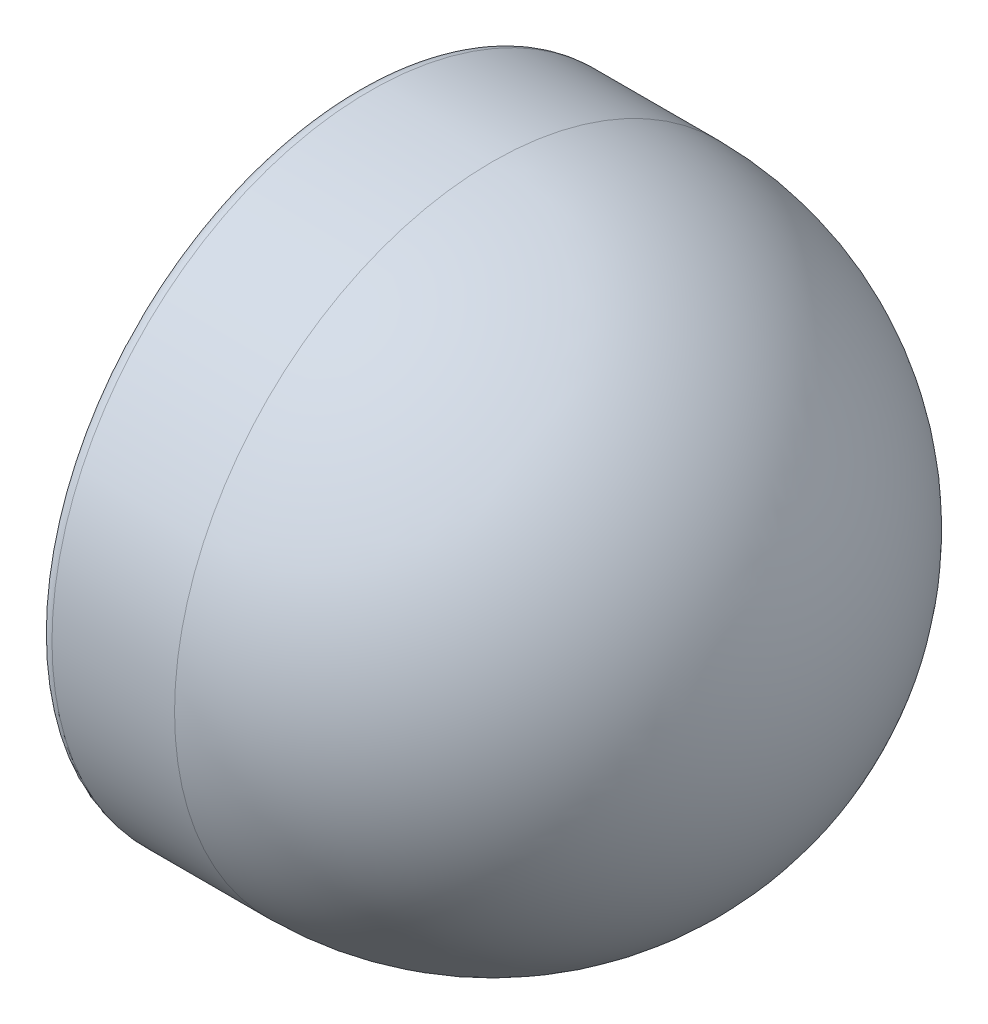
ISO-10303-21;
HEADER;
FILE_DESCRIPTION(('STEP AP214'),'2;1');
FILE_NAME('part.step','',(''),(''),'','','');
FILE_SCHEMA(('AUTOMOTIVE_DESIGN { 1 0 10303 214 1 1 1 1 }'));
ENDSEC;
DATA;
#1=APPLICATION_CONTEXT('core data for automotive mechanical design processes');
#2=APPLICATION_PROTOCOL_DEFINITION('international standard','automotive_design',2000,#1);
#3=PRODUCT_CONTEXT('',#1,'mechanical');
#4=PRODUCT('Part','Part','',(#3));
#5=PRODUCT_RELATED_PRODUCT_CATEGORY('part','',(#4));
#6=PRODUCT_DEFINITION_FORMATION('','',#4);
#7=PRODUCT_DEFINITION_CONTEXT('part definition',#1,'design');
#8=PRODUCT_DEFINITION('design','',#6,#7);
#9=PRODUCT_DEFINITION_SHAPE('','',#8);
#10=(LENGTH_UNIT() NAMED_UNIT(*) SI_UNIT(.MILLI.,.METRE.));
#11=(NAMED_UNIT(*) PLANE_ANGLE_UNIT() SI_UNIT($,.RADIAN.));
#12=(NAMED_UNIT(*) SI_UNIT($,.STERADIAN.) SOLID_ANGLE_UNIT());
#13=UNCERTAINTY_MEASURE_WITH_UNIT(LENGTH_MEASURE(1.E-05),#10,'distance_accuracy_value','');
#14=(GEOMETRIC_REPRESENTATION_CONTEXT(3) GLOBAL_UNCERTAINTY_ASSIGNED_CONTEXT((#13)) GLOBAL_UNIT_ASSIGNED_CONTEXT((#10,
#11,#12)) REPRESENTATION_CONTEXT('',''));
#15=CARTESIAN_POINT('',(0.,0.,0.));
#16=DIRECTION('',(0.,0.,1.));
#17=DIRECTION('',(1.,0.,0.));
#18=AXIS2_PLACEMENT_3D('',#15,#16,#17);
#19=CARTESIAN_POINT('',(-70.,0.,0.));
#20=DIRECTION('',(-1.,0.,0.));
#21=DIRECTION('',(0.,1.,0.));
#22=AXIS2_PLACEMENT_3D('',#19,#20,#21);
#23=SPHERICAL_SURFACE('',#22,70.);
#24=CARTESIAN_POINT('',(-70.,0.,0.));
#25=DIRECTION('',(-1.,0.,0.));
#26=DIRECTION('',(0.,0.,1.));
#27=AXIS2_PLACEMENT_3D('',#24,#25,#26);
#28=CIRCLE('',#27,70.);
#29=CARTESIAN_POINT('',(-70.,0.,70.));
#30=VERTEX_POINT('',#29);
#31=EDGE_CURVE('E10',#30,#30,#28,.T.);
#32=ORIENTED_EDGE('',*,*,#31,.F.);
#33=EDGE_LOOP('',(#32));
#34=FACE_BOUND('',#33,.T.);
#35=ADVANCED_FACE('F31',(#34),#23,.T.);
#36=CARTESIAN_POINT('',(-70.,0.,0.));
#37=DIRECTION('',(-1.,0.,0.));
#38=DIRECTION('',(0.,0.,1.));
#39=AXIS2_PLACEMENT_3D('',#36,#37,#38);
#40=CYLINDRICAL_SURFACE('',#39,70.);
#41=CARTESIAN_POINT('',(-97.,0.,0.));
#42=DIRECTION('',(-1.,0.,0.));
#43=DIRECTION('',(0.,0.,1.));
#44=AXIS2_PLACEMENT_3D('',#41,#42,#43);
#45=CIRCLE('',#44,70.);
#46=CARTESIAN_POINT('',(-97.,0.,70.));
#47=VERTEX_POINT('',#46);
#48=EDGE_CURVE('E37',#47,#47,#45,.T.);
#49=ORIENTED_EDGE('',*,*,#48,.F.);
#50=EDGE_LOOP('',(#49));
#51=FACE_BOUND('',#50,.T.);
#52=ORIENTED_EDGE('',*,*,#31,.T.);
#53=EDGE_LOOP('',(#52));
#54=FACE_BOUND('',#53,.T.);
#55=ADVANCED_FACE('F178',(#51,#54),#40,.T.);
#56=CARTESIAN_POINT('',(-97.,0.,0.));
#57=DIRECTION('',(-1.,0.,0.));
#58=DIRECTION('',(0.,0.,1.));
#59=AXIS2_PLACEMENT_3D('',#56,#57,#58);
#60=TOROIDAL_SURFACE('',#59,67.,3.);
#61=CARTESIAN_POINT('',(-100.,0.,0.));
#62=DIRECTION('',(-1.,0.,0.));
#63=DIRECTION('',(0.,0.,1.));
#64=AXIS2_PLACEMENT_3D('',#61,#62,#63);
#65=CIRCLE('',#64,67.);
#66=CARTESIAN_POINT('',(-100.,0.,67.));
#67=VERTEX_POINT('',#66);
#68=EDGE_CURVE('E41',#67,#67,#65,.T.);
#69=ORIENTED_EDGE('',*,*,#68,.F.);
#70=EDGE_LOOP('',(#69));
#71=FACE_BOUND('',#70,.T.);
#72=ORIENTED_EDGE('',*,*,#48,.T.);
#73=EDGE_LOOP('',(#72));
#74=FACE_BOUND('',#73,.T.);
#75=ADVANCED_FACE('F173',(#71,#74),#60,.T.);
#76=CARTESIAN_POINT('',(-100.,67.,0.));
#77=DIRECTION('',(1.,0.,0.));
#78=DIRECTION('',(0.,0.,-1.));
#79=AXIS2_PLACEMENT_3D('',#76,#77,#78);
#80=PLANE('',#79);
#81=CARTESIAN_POINT('',(-100.,0.,0.));
#82=DIRECTION('',(-1.,0.,0.));
#83=DIRECTION('',(0.,0.,1.));
#84=AXIS2_PLACEMENT_3D('',#81,#82,#83);
#85=CIRCLE('',#84,61.5);
#86=CARTESIAN_POINT('',(-100.,0.,61.5));
#87=VERTEX_POINT('',#86);
#88=EDGE_CURVE('E45',#87,#87,#85,.T.);
#89=ORIENTED_EDGE('',*,*,#88,.F.);
#90=EDGE_LOOP('',(#89));
#91=FACE_BOUND('',#90,.T.);
#92=ORIENTED_EDGE('',*,*,#68,.T.);
#93=EDGE_LOOP('',(#92));
#94=FACE_BOUND('',#93,.T.);
#95=ADVANCED_FACE('F167',(#91,#94),#80,.F.);
#96=CARTESIAN_POINT('',(-98.5,0.,0.));
#97=DIRECTION('',(-1.,0.,0.));
#98=DIRECTION('',(0.,0.,1.));
#99=AXIS2_PLACEMENT_3D('',#96,#97,#98);
#100=TOROIDAL_SURFACE('',#99,61.5,1.5);
#101=CARTESIAN_POINT('',(-98.5,0.,0.));
#102=DIRECTION('',(-1.,0.,0.));
#103=DIRECTION('',(0.,0.,1.));
#104=AXIS2_PLACEMENT_3D('',#101,#102,#103);
#105=CIRCLE('',#104,60.);
#106=CARTESIAN_POINT('',(-98.5,0.,60.));
#107=VERTEX_POINT('',#106);
#108=EDGE_CURVE('E50',#107,#107,#105,.T.);
#109=ORIENTED_EDGE('',*,*,#108,.F.);
#110=EDGE_LOOP('',(#109));
#111=FACE_BOUND('',#110,.T.);
#112=ORIENTED_EDGE('',*,*,#88,.T.);
#113=EDGE_LOOP('',(#112));
#114=FACE_BOUND('',#113,.T.);
#115=ADVANCED_FACE('F161',(#111,#114),#100,.T.);
#116=CARTESIAN_POINT('',(-70.,0.,0.));
#117=DIRECTION('',(-1.,0.,0.));
#118=DIRECTION('',(0.,0.,1.));
#119=AXIS2_PLACEMENT_3D('',#116,#117,#118);
#120=CYLINDRICAL_SURFACE('',#119,60.);
#121=CARTESIAN_POINT('',(-96.6213203435597,0.,0.));
#122=DIRECTION('',(-1.,0.,0.));
#123=DIRECTION('',(0.,0.,1.));
#124=AXIS2_PLACEMENT_3D('',#121,#122,#123);
#125=CIRCLE('',#124,60.);
#126=CARTESIAN_POINT('',(-96.6213203435597,0.,60.));
#127=VERTEX_POINT('',#126);
#128=EDGE_CURVE('E53',#127,#127,#125,.T.);
#129=ORIENTED_EDGE('',*,*,#128,.F.);
#130=EDGE_LOOP('',(#129));
#131=FACE_BOUND('',#130,.T.);
#132=ORIENTED_EDGE('',*,*,#108,.T.);
#133=EDGE_LOOP('',(#132));
#134=FACE_BOUND('',#133,.T.);
#135=ADVANCED_FACE('F155',(#131,#134),#120,.F.);
#136=CARTESIAN_POINT('',(-96.6213203435597,0.,0.));
#137=DIRECTION('',(-1.,0.,0.));
#138=DIRECTION('',(0.,0.,1.));
#139=AXIS2_PLACEMENT_3D('',#136,#137,#138);
#140=TOROIDAL_SURFACE('',#139,61.5,1.5);
#141=CARTESIAN_POINT('',(-95.5606601717798,0.,0.));
#142=DIRECTION('',(-1.,0.,0.));
#143=DIRECTION('',(0.,0.,1.));
#144=AXIS2_PLACEMENT_3D('',#141,#142,#143);
#145=CIRCLE('',#144,60.4393398282202);
#146=CARTESIAN_POINT('',(-95.5606601717798,0.,60.4393398282202));
#147=VERTEX_POINT('',#146);
#148=EDGE_CURVE('E56',#147,#147,#145,.T.);
#149=ORIENTED_EDGE('',*,*,#148,.F.);
#150=EDGE_LOOP('',(#149));
#151=FACE_BOUND('',#150,.T.);
#152=ORIENTED_EDGE('',*,*,#128,.T.);
#153=EDGE_LOOP('',(#152));
#154=FACE_BOUND('',#153,.T.);
#155=ADVANCED_FACE('F149',(#151,#154),#140,.T.);
#156=CARTESIAN_POINT('',(-95.5606601717798,0.,0.));
#157=DIRECTION('',(1.,0.,0.));
#158=DIRECTION('',(0.,0.,-1.));
#159=AXIS2_PLACEMENT_3D('',#156,#157,#158);
#160=CONICAL_SURFACE('',#159,60.4393398282202,0.785398163397451);
#161=CARTESIAN_POINT('',(-92.,0.,0.));
#162=DIRECTION('',(-1.,0.,0.));
#163=DIRECTION('',(0.,0.,1.));
#164=AXIS2_PLACEMENT_3D('',#161,#162,#163);
#165=CIRCLE('',#164,64.);
#166=CARTESIAN_POINT('',(-92.,0.,64.));
#167=VERTEX_POINT('',#166);
#168=EDGE_CURVE('E59',#167,#167,#165,.T.);
#169=ORIENTED_EDGE('',*,*,#168,.F.);
#170=EDGE_LOOP('',(#169));
#171=FACE_BOUND('',#170,.T.);
#172=ORIENTED_EDGE('',*,*,#148,.T.);
#173=EDGE_LOOP('',(#172));
#174=FACE_BOUND('',#173,.T.);
#175=ADVANCED_FACE('F143',(#171,#174),#160,.F.);
#176=CARTESIAN_POINT('',(-92.,64.,0.));
#177=DIRECTION('',(-1.,0.,0.));
#178=DIRECTION('',(0.,0.,1.));
#179=AXIS2_PLACEMENT_3D('',#176,#177,#178);
#180=PLANE('',#179);
#181=CARTESIAN_POINT('',(-92.,0.,0.));
#182=DIRECTION('',(-1.,0.,0.));
#183=DIRECTION('',(0.,0.,1.));
#184=AXIS2_PLACEMENT_3D('',#181,#182,#183);
#185=CIRCLE('',#184,64.7071067811866);
#186=CARTESIAN_POINT('',(-92.,0.,64.7071067811866));
#187=VERTEX_POINT('',#186);
#188=EDGE_CURVE('E62',#187,#187,#185,.T.);
#189=ORIENTED_EDGE('',*,*,#188,.F.);
#190=EDGE_LOOP('',(#189));
#191=FACE_BOUND('',#190,.T.);
#192=ORIENTED_EDGE('',*,*,#168,.T.);
#193=EDGE_LOOP('',(#192));
#194=FACE_BOUND('',#193,.T.);
#195=ADVANCED_FACE('F137',(#191,#194),#180,.F.);
#196=CARTESIAN_POINT('',(-70.,0.,0.));
#197=DIRECTION('',(-1.,0.,0.));
#198=DIRECTION('',(0.,0.,1.));
#199=AXIS2_PLACEMENT_3D('',#196,#197,#198);
#200=CYLINDRICAL_SURFACE('',#199,64.7071067811866);
#201=CARTESIAN_POINT('',(-92.7071067811866,0.,0.));
#202=DIRECTION('',(-1.,0.,0.));
#203=DIRECTION('',(0.,0.,1.));
#204=AXIS2_PLACEMENT_3D('',#201,#202,#203);
#205=CIRCLE('',#204,64.7071067811866);
#206=CARTESIAN_POINT('',(-92.7071067811866,0.,64.7071067811866));
#207=VERTEX_POINT('',#206);
#208=EDGE_CURVE('E65',#207,#207,#205,.T.);
#209=ORIENTED_EDGE('',*,*,#208,.F.);
#210=EDGE_LOOP('',(#209));
#211=FACE_BOUND('',#210,.T.);
#212=ORIENTED_EDGE('',*,*,#188,.T.);
#213=EDGE_LOOP('',(#212));
#214=FACE_BOUND('',#213,.T.);
#215=ADVANCED_FACE('F131',(#211,#214),#200,.T.);
#216=CARTESIAN_POINT('',(-92.7071067811866,0.,0.));
#217=DIRECTION('',(1.,0.,0.));
#218=DIRECTION('',(0.,0.,-1.));
#219=AXIS2_PLACEMENT_3D('',#216,#217,#218);
#220=CONICAL_SURFACE('',#219,64.7071067811866,0.785398163397449);
#221=CARTESIAN_POINT('',(-96.2677669529664,0.,0.));
#222=DIRECTION('',(-1.,0.,0.));
#223=DIRECTION('',(0.,0.,1.));
#224=AXIS2_PLACEMENT_3D('',#221,#222,#223);
#225=CIRCLE('',#224,61.1464466094067);
#226=CARTESIAN_POINT('',(-96.2677669529664,0.,61.1464466094067));
#227=VERTEX_POINT('',#226);
#228=EDGE_CURVE('E68',#227,#227,#225,.T.);
#229=ORIENTED_EDGE('',*,*,#228,.F.);
#230=EDGE_LOOP('',(#229));
#231=FACE_BOUND('',#230,.T.);
#232=ORIENTED_EDGE('',*,*,#208,.T.);
#233=EDGE_LOOP('',(#232));
#234=FACE_BOUND('',#233,.T.);
#235=ADVANCED_FACE('F125',(#231,#234),#220,.T.);
#236=CARTESIAN_POINT('',(-96.6213203435597,0.,0.));
#237=DIRECTION('',(-1.,0.,0.));
#238=DIRECTION('',(0.,0.,1.));
#239=AXIS2_PLACEMENT_3D('',#236,#237,#238);
#240=TOROIDAL_SURFACE('',#239,61.5,0.499999999999999);
#241=CARTESIAN_POINT('',(-96.6213203435597,0.,0.));
#242=DIRECTION('',(-1.,0.,0.));
#243=DIRECTION('',(0.,0.,1.));
#244=AXIS2_PLACEMENT_3D('',#241,#242,#243);
#245=CIRCLE('',#244,61.);
#246=CARTESIAN_POINT('',(-96.6213203435597,0.,61.));
#247=VERTEX_POINT('',#246);
#248=EDGE_CURVE('E71',#247,#247,#245,.T.);
#249=ORIENTED_EDGE('',*,*,#248,.F.);
#250=EDGE_LOOP('',(#249));
#251=FACE_BOUND('',#250,.T.);
#252=ORIENTED_EDGE('',*,*,#228,.T.);
#253=EDGE_LOOP('',(#252));
#254=FACE_BOUND('',#253,.T.);
#255=ADVANCED_FACE('F119',(#251,#254),#240,.F.);
#256=CARTESIAN_POINT('',(-70.,0.,0.));
#257=DIRECTION('',(-1.,0.,0.));
#258=DIRECTION('',(0.,0.,1.));
#259=AXIS2_PLACEMENT_3D('',#256,#257,#258);
#260=CYLINDRICAL_SURFACE('',#259,61.);
#261=CARTESIAN_POINT('',(-98.5,0.,0.));
#262=DIRECTION('',(-1.,0.,0.));
#263=DIRECTION('',(0.,0.,1.));
#264=AXIS2_PLACEMENT_3D('',#261,#262,#263);
#265=CIRCLE('',#264,61.);
#266=CARTESIAN_POINT('',(-98.5,0.,61.));
#267=VERTEX_POINT('',#266);
#268=EDGE_CURVE('E74',#267,#267,#265,.T.);
#269=ORIENTED_EDGE('',*,*,#268,.F.);
#270=EDGE_LOOP('',(#269));
#271=FACE_BOUND('',#270,.T.);
#272=ORIENTED_EDGE('',*,*,#248,.T.);
#273=EDGE_LOOP('',(#272));
#274=FACE_BOUND('',#273,.T.);
#275=ADVANCED_FACE('F113',(#271,#274),#260,.T.);
#276=CARTESIAN_POINT('',(-98.5,0.,0.));
#277=DIRECTION('',(-1.,0.,0.));
#278=DIRECTION('',(0.,0.,1.));
#279=AXIS2_PLACEMENT_3D('',#276,#277,#278);
#280=TOROIDAL_SURFACE('',#279,61.5,0.5);
#281=CARTESIAN_POINT('',(-99.,0.,0.));
#282=DIRECTION('',(-1.,0.,0.));
#283=DIRECTION('',(0.,0.,1.));
#284=AXIS2_PLACEMENT_3D('',#281,#282,#283);
#285=CIRCLE('',#284,61.5);
#286=CARTESIAN_POINT('',(-99.,0.,61.5));
#287=VERTEX_POINT('',#286);
#288=EDGE_CURVE('E77',#287,#287,#285,.T.);
#289=ORIENTED_EDGE('',*,*,#288,.F.);
#290=EDGE_LOOP('',(#289));
#291=FACE_BOUND('',#290,.T.);
#292=ORIENTED_EDGE('',*,*,#268,.T.);
#293=EDGE_LOOP('',(#292));
#294=FACE_BOUND('',#293,.T.);
#295=ADVANCED_FACE('F107',(#291,#294),#280,.F.);
#296=CARTESIAN_POINT('',(-99.,67.,0.));
#297=DIRECTION('',(-1.,0.,0.));
#298=DIRECTION('',(0.,0.,1.));
#299=AXIS2_PLACEMENT_3D('',#296,#297,#298);
#300=PLANE('',#299);
#301=CARTESIAN_POINT('',(-99.,0.,0.));
#302=DIRECTION('',(-1.,0.,0.));
#303=DIRECTION('',(0.,0.,1.));
#304=AXIS2_PLACEMENT_3D('',#301,#302,#303);
#305=CIRCLE('',#304,67.);
#306=CARTESIAN_POINT('',(-99.,0.,67.));
#307=VERTEX_POINT('',#306);
#308=EDGE_CURVE('E80',#307,#307,#305,.T.);
#309=ORIENTED_EDGE('',*,*,#308,.F.);
#310=EDGE_LOOP('',(#309));
#311=FACE_BOUND('',#310,.T.);
#312=ORIENTED_EDGE('',*,*,#288,.T.);
#313=EDGE_LOOP('',(#312));
#314=FACE_BOUND('',#313,.T.);
#315=ADVANCED_FACE('F101',(#311,#314),#300,.F.);
#316=CARTESIAN_POINT('',(-97.,0.,0.));
#317=DIRECTION('',(-1.,0.,0.));
#318=DIRECTION('',(0.,0.,1.));
#319=AXIS2_PLACEMENT_3D('',#316,#317,#318);
#320=TOROIDAL_SURFACE('',#319,67.,2.);
#321=CARTESIAN_POINT('',(-97.,0.,0.));
#322=DIRECTION('',(-1.,0.,0.));
#323=DIRECTION('',(0.,0.,1.));
#324=AXIS2_PLACEMENT_3D('',#321,#322,#323);
#325=CIRCLE('',#324,69.);
#326=CARTESIAN_POINT('',(-97.,0.,69.));
#327=VERTEX_POINT('',#326);
#328=EDGE_CURVE('E83',#327,#327,#325,.T.);
#329=ORIENTED_EDGE('',*,*,#328,.F.);
#330=EDGE_LOOP('',(#329));
#331=FACE_BOUND('',#330,.T.);
#332=ORIENTED_EDGE('',*,*,#308,.T.);
#333=EDGE_LOOP('',(#332));
#334=FACE_BOUND('',#333,.T.);
#335=ADVANCED_FACE('F95',(#331,#334),#320,.F.);
#336=CARTESIAN_POINT('',(-70.,0.,0.));
#337=DIRECTION('',(-1.,0.,0.));
#338=DIRECTION('',(0.,0.,1.));
#339=AXIS2_PLACEMENT_3D('',#336,#337,#338);
#340=CYLINDRICAL_SURFACE('',#339,69.);
#341=CARTESIAN_POINT('',(-70.,0.,0.));
#342=DIRECTION('',(-1.,0.,0.));
#343=DIRECTION('',(0.,0.,1.));
#344=AXIS2_PLACEMENT_3D('',#341,#342,#343);
#345=CIRCLE('',#344,69.);
#346=CARTESIAN_POINT('',(-70.,0.,69.));
#347=VERTEX_POINT('',#346);
#348=EDGE_CURVE('E86',#347,#347,#345,.T.);
#349=ORIENTED_EDGE('',*,*,#348,.F.);
#350=EDGE_LOOP('',(#349));
#351=FACE_BOUND('',#350,.T.);
#352=ORIENTED_EDGE('',*,*,#328,.T.);
#353=EDGE_LOOP('',(#352));
#354=FACE_BOUND('',#353,.T.);
#355=ADVANCED_FACE('F92',(#351,#354),#340,.F.);
#356=CARTESIAN_POINT('',(-70.,0.,0.));
#357=DIRECTION('',(-1.,0.,0.));
#358=DIRECTION('',(0.,1.,0.));
#359=AXIS2_PLACEMENT_3D('',#356,#357,#358);
#360=SPHERICAL_SURFACE('',#359,69.);
#361=ORIENTED_EDGE('',*,*,#348,.T.);
#362=EDGE_LOOP('',(#361));
#363=FACE_BOUND('',#362,.T.);
#364=ADVANCED_FACE('F90',(#363),#360,.F.);
#365=CLOSED_SHELL('',(#35,#55,#75,#95,#115,#135,#155,#175,#195,#215,#235,#255,#275,#295,#315,
#335,#355,#364));
#366=MANIFOLD_SOLID_BREP('B2',#365);
#367=ADVANCED_BREP_SHAPE_REPRESENTATION('',(#18,#366),#14);
#368=SHAPE_DEFINITION_REPRESENTATION(#9,#367);
ENDSEC;
END-ISO-10303-21;
